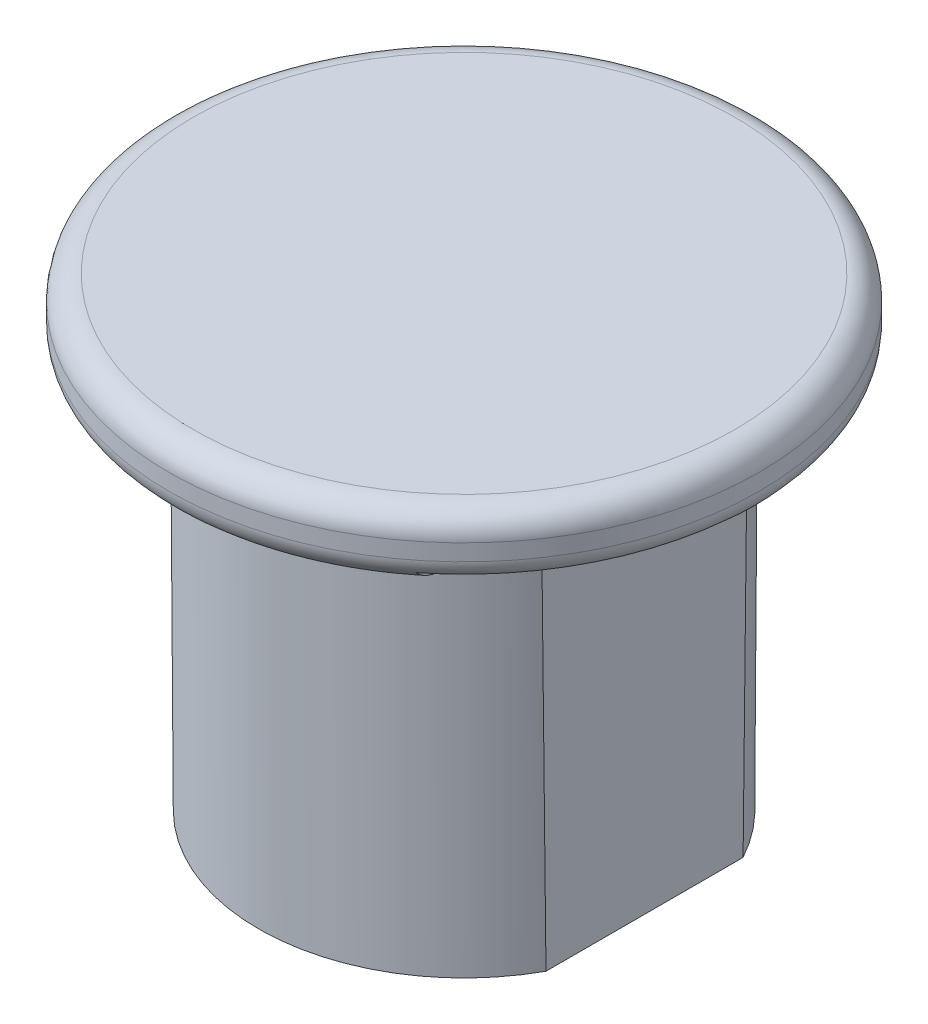
ISO-10303-21;
HEADER;
FILE_DESCRIPTION(('STEP AP214'),'2;1');
FILE_NAME('part.step','',(''),(''),'','','');
FILE_SCHEMA(('AUTOMOTIVE_DESIGN { 1 0 10303 214 1 1 1 1 }'));
ENDSEC;
DATA;
#1=APPLICATION_CONTEXT('core data for automotive mechanical design processes');
#2=APPLICATION_PROTOCOL_DEFINITION('international standard','automotive_design',2000,#1);
#3=PRODUCT_CONTEXT('',#1,'mechanical');
#4=PRODUCT('Part','Part','',(#3));
#5=PRODUCT_RELATED_PRODUCT_CATEGORY('part','',(#4));
#6=PRODUCT_DEFINITION_FORMATION('','',#4);
#7=PRODUCT_DEFINITION_CONTEXT('part definition',#1,'design');
#8=PRODUCT_DEFINITION('design','',#6,#7);
#9=PRODUCT_DEFINITION_SHAPE('','',#8);
#10=(LENGTH_UNIT() NAMED_UNIT(*) SI_UNIT(.MILLI.,.METRE.));
#11=(NAMED_UNIT(*) PLANE_ANGLE_UNIT() SI_UNIT($,.RADIAN.));
#12=(NAMED_UNIT(*) SI_UNIT($,.STERADIAN.) SOLID_ANGLE_UNIT());
#13=UNCERTAINTY_MEASURE_WITH_UNIT(LENGTH_MEASURE(1.E-05),#10,'distance_accuracy_value','');
#14=(GEOMETRIC_REPRESENTATION_CONTEXT(3) GLOBAL_UNCERTAINTY_ASSIGNED_CONTEXT((#13)) GLOBAL_UNIT_ASSIGNED_CONTEXT((#10,
#11,#12)) REPRESENTATION_CONTEXT('',''));
#15=CARTESIAN_POINT('',(0.,0.,0.));
#16=DIRECTION('',(0.,0.,1.));
#17=DIRECTION('',(1.,0.,0.));
#18=AXIS2_PLACEMENT_3D('',#15,#16,#17);
#19=CARTESIAN_POINT('',(0.,0.,0.));
#20=DIRECTION('',(0.,1.,0.));
#21=DIRECTION('',(0.,0.,-1.));
#22=AXIS2_PLACEMENT_3D('',#19,#20,#21);
#23=PLANE('',#22);
#24=CARTESIAN_POINT('',(0.,0.,0.));
#25=DIRECTION('',(0.,1.,0.));
#26=DIRECTION('',(1.,0.,0.));
#27=AXIS2_PLACEMENT_3D('',#24,#25,#26);
#28=CIRCLE('',#27,3.76);
#29=CARTESIAN_POINT('',(3.3,0.,-1.802109874564));
#30=VERTEX_POINT('',#29);
#31=CARTESIAN_POINT('',(3.3,0.,1.802109874564));
#32=VERTEX_POINT('',#31);
#33=EDGE_CURVE('E11',#30,#32,#28,.T.);
#34=ORIENTED_EDGE('',*,*,#33,.F.);
#35=DIRECTION('',(0.,0.,-1.));
#36=VECTOR('',#35,1.);
#37=CARTESIAN_POINT('',(3.3,0.,-2.5));
#38=LINE('',#37,#36);
#39=EDGE_CURVE('E100',#32,#30,#38,.T.);
#40=ORIENTED_EDGE('',*,*,#39,.F.);
#41=EDGE_LOOP('',(#34,#40));
#42=FACE_BOUND('',#41,.T.);
#43=ADVANCED_FACE('F17',(#42),#23,.F.);
#44=CARTESIAN_POINT('',(0.,0.,0.));
#45=DIRECTION('',(0.,1.,0.));
#46=DIRECTION('',(1.,0.,0.));
#47=AXIS2_PLACEMENT_3D('',#44,#45,#46);
#48=CONICAL_SURFACE('',#47,3.76,0.00547939721669572);
#49=CARTESIAN_POINT('',(0.,7.3,0.));
#50=DIRECTION('',(0.,1.,0.));
#51=DIRECTION('',(1.,0.,0.));
#52=AXIS2_PLACEMENT_3D('',#49,#50,#51);
#53=CIRCLE('',#52,3.8);
#54=CARTESIAN_POINT('',(3.3,7.3,-1.884144368142));
#55=VERTEX_POINT('',#54);
#56=CARTESIAN_POINT('',(3.3,7.3,1.884144368142));
#57=VERTEX_POINT('',#56);
#58=EDGE_CURVE('E29',#55,#57,#53,.T.);
#59=ORIENTED_EDGE('',*,*,#58,.F.);
#60=CARTESIAN_POINT('',(3.3,8.030037745854E-11,-1.802109874565));
#61=CARTESIAN_POINT('',(3.3,1.824997814763,-1.822974282172));
#62=CARTESIAN_POINT('',(3.3,3.64999717058,-1.843590626793));
#63=CARTESIAN_POINT('',(3.3,5.474997933768,-1.863976039395));
#64=CARTESIAN_POINT('',(3.3,7.3,-1.884144368142));
#65=B_SPLINE_CURVE_WITH_KNOTS('',4,(#60,#61,#62,#63,#64),.UNSPECIFIED.,.F.,.F.,(5,5),(0.,1.),.UNSPECIFIED.);
#66=EDGE_CURVE('E140',#30,#55,#65,.T.);
#67=ORIENTED_EDGE('',*,*,#66,.F.);
#68=ORIENTED_EDGE('',*,*,#33,.T.);
#69=CARTESIAN_POINT('',(3.3,7.3,1.884144368142));
#70=CARTESIAN_POINT('',(3.3,5.474997933786,1.863976039395));
#71=CARTESIAN_POINT('',(3.3,3.649997170523,1.843590626792));
#72=CARTESIAN_POINT('',(3.3,1.824997814895,1.822974282174));
#73=CARTESIAN_POINT('',(3.3,2.318742420293E-10,1.802109874566));
#74=B_SPLINE_CURVE_WITH_KNOTS('',4,(#69,#70,#71,#72,#73),.UNSPECIFIED.,.F.,.F.,(5,5),(0.,1.),.UNSPECIFIED.);
#75=EDGE_CURVE('E92',#57,#32,#74,.T.);
#76=ORIENTED_EDGE('',*,*,#75,.F.);
#77=EDGE_LOOP('',(#59,#67,#68,#76));
#78=FACE_BOUND('',#77,.T.);
#79=ADVANCED_FACE('F91',(#78),#48,.T.);
#80=CARTESIAN_POINT('',(0.,8.5,0.));
#81=DIRECTION('',(0.,1.,0.));
#82=DIRECTION('',(0.,0.,-1.));
#83=AXIS2_PLACEMENT_3D('',#80,#81,#82);
#84=PLANE('',#83);
#85=CARTESIAN_POINT('',(0.,8.5,0.));
#86=DIRECTION('',(0.,1.,0.));
#87=DIRECTION('',(1.,0.,0.));
#88=AXIS2_PLACEMENT_3D('',#85,#86,#87);
#89=CIRCLE('',#88,4.95);
#90=CARTESIAN_POINT('',(4.95,8.5,0.));
#91=VERTEX_POINT('',#90);
#92=EDGE_CURVE('E127',#91,#91,#89,.T.);
#93=ORIENTED_EDGE('',*,*,#92,.T.);
#94=EDGE_LOOP('',(#93));
#95=FACE_BOUND('',#94,.T.);
#96=ADVANCED_FACE('F228',(#95),#84,.T.);
#97=CARTESIAN_POINT('',(0.,7.3,0.));
#98=DIRECTION('',(0.,1.,0.));
#99=DIRECTION('',(0.,0.,-1.));
#100=AXIS2_PLACEMENT_3D('',#97,#98,#99);
#101=PLANE('',#100);
#102=ORIENTED_EDGE('',*,*,#58,.T.);
#103=DIRECTION('',(0.,0.,-1.));
#104=VECTOR('',#103,1.);
#105=CARTESIAN_POINT('',(3.3,7.3,-2.5));
#106=LINE('',#105,#104);
#107=CARTESIAN_POINT('',(3.3,7.3,3.689512162875));
#108=VERTEX_POINT('',#107);
#109=EDGE_CURVE('E83',#108,#57,#106,.T.);
#110=ORIENTED_EDGE('',*,*,#109,.F.);
#111=CARTESIAN_POINT('',(0.,7.3,0.));
#112=DIRECTION('',(0.,1.,0.));
#113=DIRECTION('',(1.,0.,0.));
#114=AXIS2_PLACEMENT_3D('',#111,#112,#113);
#115=CIRCLE('',#114,4.95);
#116=CARTESIAN_POINT('',(3.3,7.3,-3.689512162875));
#117=VERTEX_POINT('',#116);
#118=EDGE_CURVE('E118',#117,#108,#115,.T.);
#119=ORIENTED_EDGE('',*,*,#118,.F.);
#120=DIRECTION('',(0.,0.,-1.));
#121=VECTOR('',#120,1.);
#122=CARTESIAN_POINT('',(3.3,7.3,-2.5));
#123=LINE('',#122,#121);
#124=EDGE_CURVE('E89',#55,#117,#123,.T.);
#125=ORIENTED_EDGE('',*,*,#124,.F.);
#126=EDGE_LOOP('',(#102,#110,#119,#125));
#127=FACE_BOUND('',#126,.T.);
#128=ADVANCED_FACE('F81',(#127),#101,.F.);
#129=CARTESIAN_POINT('',(3.3,-0.2,-5.));
#130=DIRECTION('',(1.,0.,0.));
#131=DIRECTION('',(0.,1.,0.));
#132=AXIS2_PLACEMENT_3D('',#129,#130,#131);
#133=PLANE('',#132);
#134=DIRECTION('',(0.,0.,1.));
#135=VECTOR('',#134,1.);
#136=CARTESIAN_POINT('',(3.3,7.5,-5.));
#137=LINE('',#136,#135);
#138=CARTESIAN_POINT('',(3.3,7.5,-4.178126471627));
#139=VERTEX_POINT('',#138);
#140=CARTESIAN_POINT('',(3.3,7.5,4.178126471627));
#141=VERTEX_POINT('',#140);
#142=EDGE_CURVE('E102',#139,#141,#137,.T.);
#143=ORIENTED_EDGE('',*,*,#142,.T.);
#144=CARTESIAN_POINT('',(3.3,7.75,4.274342054633));
#145=CARTESIAN_POINT('',(3.3,7.716355003804,4.274342054633));
#146=CARTESIAN_POINT('',(3.3,7.68270779858,4.270528458825));
#147=CARTESIAN_POINT('',(3.3,7.649437517967,4.262900393972));
#148=CARTESIAN_POINT('',(3.3,7.616913692919,4.251541631836));
#149=CARTESIAN_POINT('',(3.3,7.585480458481,4.236609153892));
#150=CARTESIAN_POINT('',(3.3,7.52503709021,4.19981270062));
#151=CARTESIAN_POINT('',(3.3,7.496058000717,4.177865006577));
#152=CARTESIAN_POINT('',(3.3,7.468816945847,4.15270361159));
#153=CARTESIAN_POINT('',(3.3,7.443573658995,4.124607680797));
#154=CARTESIAN_POINT('',(3.3,7.420534828386,4.093890900861));
#155=CARTESIAN_POINT('',(3.3,7.367268740544,4.008868650043));
#156=CARTESIAN_POINT('',(3.3,7.340540563001,3.951165763041));
#157=CARTESIAN_POINT('',(3.3,7.320267119463,3.889048338208));
#158=CARTESIAN_POINT('',(3.3,7.306732704443,3.823866872133));
#159=CARTESIAN_POINT('',(3.3,7.3,3.756925390347));
#160=CARTESIAN_POINT('',(3.3,7.3,3.689512162875));
#161=B_SPLINE_CURVE_WITH_KNOTS('',6,(#144,#145,#146,#147,#148,#149,#150,#151,#152,#153,#154,
#155,#156,#157,#158,#159,#160),.UNSPECIFIED.,.F.,.F.,(7,5,5,7),(0.,0.277244003559,
0.557847201163,1.),.UNSPECIFIED.);
#162=EDGE_CURVE('E101',#141,#108,#161,.T.);
#163=ORIENTED_EDGE('',*,*,#162,.T.);
#164=ORIENTED_EDGE('',*,*,#109,.T.);
#165=ORIENTED_EDGE('',*,*,#75,.T.);
#166=ORIENTED_EDGE('',*,*,#39,.T.);
#167=ORIENTED_EDGE('',*,*,#66,.T.);
#168=ORIENTED_EDGE('',*,*,#124,.T.);
#169=CARTESIAN_POINT('',(3.3,7.75,-4.274342054633));
#170=CARTESIAN_POINT('',(3.3,7.716355003803,-4.274342054633));
#171=CARTESIAN_POINT('',(3.3,7.68270779858,-4.270528458825));
#172=CARTESIAN_POINT('',(3.3,7.649437517967,-4.262900393972));
#173=CARTESIAN_POINT('',(3.3,7.616913692918,-4.251541631836));
#174=CARTESIAN_POINT('',(3.3,7.58548045848,-4.236609153891));
#175=CARTESIAN_POINT('',(3.3,7.525037090209,-4.199812700619));
#176=CARTESIAN_POINT('',(3.3,7.496058000716,-4.177865006577));
#177=CARTESIAN_POINT('',(3.3,7.468816945846,-4.152703611589));
#178=CARTESIAN_POINT('',(3.3,7.443573658994,-4.124607680796));
#179=CARTESIAN_POINT('',(3.3,7.420534828385,-4.09389090086));
#180=CARTESIAN_POINT('',(3.3,7.367268740543,-4.008868650042));
#181=CARTESIAN_POINT('',(3.3,7.340540563001,-3.95116576304));
#182=CARTESIAN_POINT('',(3.3,7.320267119463,-3.889048338207));
#183=CARTESIAN_POINT('',(3.3,7.306732704443,-3.823866872132));
#184=CARTESIAN_POINT('',(3.3,7.3,-3.756925390346));
#185=CARTESIAN_POINT('',(3.3,7.3,-3.689512162875));
#186=B_SPLINE_CURVE_WITH_KNOTS('',6,(#169,#170,#171,#172,#173,#174,#175,#176,#177,#178,#179,
#180,#181,#182,#183,#184,#185),.UNSPECIFIED.,.F.,.F.,(7,5,5,7),(0.,0.27724400356,0.557847201165,
1.),.UNSPECIFIED.);
#187=EDGE_CURVE('E20',#139,#117,#186,.T.);
#188=ORIENTED_EDGE('',*,*,#187,.F.);
#189=EDGE_LOOP('',(#143,#163,#164,#165,#166,#167,#168,#188));
#190=FACE_BOUND('',#189,.T.);
#191=ADVANCED_FACE('F99',(#190),#133,.T.);
#192=CARTESIAN_POINT('',(3.3,7.5,-5.));
#193=DIRECTION('',(0.,1.,0.));
#194=DIRECTION('',(1.,0.,0.));
#195=AXIS2_PLACEMENT_3D('',#192,#193,#194);
#196=PLANE('',#195);
#197=CARTESIAN_POINT('',(0.,7.5,0.));
#198=DIRECTION('',(0.,-1.,0.));
#199=DIRECTION('',(1.,0.,0.));
#200=AXIS2_PLACEMENT_3D('',#197,#198,#199);
#201=CIRCLE('',#200,5.324165738677);
#202=CARTESIAN_POINT('',(5.3,7.5,0.506695976801));
#203=VERTEX_POINT('',#202);
#204=EDGE_CURVE('E124',#203,#141,#201,.T.);
#205=ORIENTED_EDGE('',*,*,#204,.T.);
#206=ORIENTED_EDGE('',*,*,#142,.F.);
#207=CARTESIAN_POINT('',(0.,7.5,0.));
#208=DIRECTION('',(0.,-1.,0.));
#209=DIRECTION('',(1.,0.,0.));
#210=AXIS2_PLACEMENT_3D('',#207,#208,#209);
#211=CIRCLE('',#210,5.324165738677);
#212=CARTESIAN_POINT('',(5.3,7.5,-0.506695976801));
#213=VERTEX_POINT('',#212);
#214=EDGE_CURVE('E117',#139,#213,#211,.T.);
#215=ORIENTED_EDGE('',*,*,#214,.T.);
#216=DIRECTION('',(0.,0.,1.));
#217=VECTOR('',#216,1.);
#218=CARTESIAN_POINT('',(5.3,7.5,-5.));
#219=LINE('',#218,#217);
#220=EDGE_CURVE('E109',#213,#203,#219,.T.);
#221=ORIENTED_EDGE('',*,*,#220,.T.);
#222=EDGE_LOOP('',(#205,#206,#215,#221));
#223=FACE_BOUND('',#222,.T.);
#224=ADVANCED_FACE('F236',(#223),#196,.F.);
#225=CARTESIAN_POINT('',(5.3,-0.2,-5.));
#226=DIRECTION('',(1.,0.,0.));
#227=DIRECTION('',(0.,1.,0.));
#228=AXIS2_PLACEMENT_3D('',#225,#226,#227);
#229=PLANE('',#228);
#230=CARTESIAN_POINT('',(5.3,7.75,-1.034408043279));
#231=CARTESIAN_POINT('',(5.3,7.737100951975,-1.034408043279));
#232=CARTESIAN_POINT('',(5.3,7.724197389763,-1.032202019081));
#233=CARTESIAN_POINT('',(5.3,7.711388968665,-1.027787592253));
#234=CARTESIAN_POINT('',(5.3,7.698763173049,-1.021219958709));
#235=CARTESIAN_POINT('',(5.3,7.686394926562,-1.012595361165));
#236=CARTESIAN_POINT('',(5.3,7.674346626327,-1.002038306961));
#237=CARTESIAN_POINT('',(5.3,7.662668601114,-0.989692531274));
#238=CARTESIAN_POINT('',(5.3,7.644164608334,-0.966741418968));
#239=CARTESIAN_POINT('',(5.3,7.637095229494,-0.957091171362));
#240=CARTESIAN_POINT('',(5.3,7.630200046957,-0.946802890366));
#241=CARTESIAN_POINT('',(5.3,7.623485015174,-0.935914513045));
#242=CARTESIAN_POINT('',(5.3,7.616954107629,-0.924463289156));
#243=CARTESIAN_POINT('',(5.3,7.610609571438,-0.912485084265));
#244=CARTESIAN_POINT('',(5.3,7.604452181938,-0.900013682853));
#245=CARTESIAN_POINT('',(5.3,7.590334166592,-0.869431487914));
#246=CARTESIAN_POINT('',(5.3,7.582535366794,-0.850924260786));
#247=CARTESIAN_POINT('',(5.3,7.575083039545,-0.831636209564));
#248=CARTESIAN_POINT('',(5.3,7.567972725491,-0.811639254942));
#249=CARTESIAN_POINT('',(5.3,7.561198009293,-0.79099895137));
#250=CARTESIAN_POINT('',(5.3,7.554750964662,-0.769773999643));
#251=CARTESIAN_POINT('',(5.3,7.548622599387,-0.748015759487));
#252=CARTESIAN_POINT('',(5.3,7.522166698397,-0.646871134866));
#253=CARTESIAN_POINT('',(5.3,7.505470168735,-0.562020760468));
#254=CARTESIAN_POINT('',(5.3,7.492179665994,-0.472941515529));
#255=CARTESIAN_POINT('',(5.3,7.481966976553,-0.380885775843));
#256=CARTESIAN_POINT('',(5.3,7.474511987254,-0.286904878757));
#257=CARTESIAN_POINT('',(5.3,7.469618614014,-0.191766974579));
#258=CARTESIAN_POINT('',(5.3,7.467157287525,-0.09603855408853));
#259=CARTESIAN_POINT('',(5.3,7.467157287525,0.));
#260=B_SPLINE_CURVE_WITH_KNOTS('',8,(#230,#231,#232,#233,#234,#235,#236,#237,#238,#239,#240,
#241,#242,#243,#244,#245,#246,#247,#248,#249,#250,#251,#252,#253,#254,#255,#256,#257,#258,#259),
.UNSPECIFIED.,.F.,.F.,(9,7,7,7,9),(0.,0.177768135154,0.291910091734,0.447663128132,1.),.UNSPECIFIED.);
#261=CARTESIAN_POINT('',(5.3,7.467157287525,0.));
#262=VERTEX_POINT('',#261);
#263=EDGE_CURVE('E132',#213,#262,#260,.T.);
#264=ORIENTED_EDGE('',*,*,#263,.T.);
#265=CARTESIAN_POINT('',(5.3,7.75,1.034408043279));
#266=CARTESIAN_POINT('',(5.3,7.737100951975,1.034408043279));
#267=CARTESIAN_POINT('',(5.3,7.724197389762,1.032202019081));
#268=CARTESIAN_POINT('',(5.3,7.711388968665,1.027787592253));
#269=CARTESIAN_POINT('',(5.3,7.698763173049,1.021219958709));
#270=CARTESIAN_POINT('',(5.3,7.686394926561,1.012595361164));
#271=CARTESIAN_POINT('',(5.3,7.674346626327,1.00203830696));
#272=CARTESIAN_POINT('',(5.3,7.662668601113,0.989692531274));
#273=CARTESIAN_POINT('',(5.3,7.644164608333,0.966741418967));
#274=CARTESIAN_POINT('',(5.3,7.637095229493,0.957091171361));
#275=CARTESIAN_POINT('',(5.3,7.630200046957,0.946802890365));
#276=CARTESIAN_POINT('',(5.3,7.623485015173,0.935914513044));
#277=CARTESIAN_POINT('',(5.3,7.616954107629,0.924463289155));
#278=CARTESIAN_POINT('',(5.3,7.610609571438,0.912485084264));
#279=CARTESIAN_POINT('',(5.3,7.604452181938,0.900013682851));
#280=CARTESIAN_POINT('',(5.3,7.590334166591,0.869431487913));
#281=CARTESIAN_POINT('',(5.3,7.582535366794,0.850924260784));
#282=CARTESIAN_POINT('',(5.3,7.575083039545,0.831636209562));
#283=CARTESIAN_POINT('',(5.3,7.56797272549,0.81163925494));
#284=CARTESIAN_POINT('',(5.3,7.561198009292,0.790998951368));
#285=CARTESIAN_POINT('',(5.3,7.554750964661,0.769773999642));
#286=CARTESIAN_POINT('',(5.3,7.548622599386,0.748015759485));
#287=CARTESIAN_POINT('',(5.3,7.522166698397,0.646871134864));
#288=CARTESIAN_POINT('',(5.3,7.505470168734,0.562020760466));
#289=CARTESIAN_POINT('',(5.3,7.492179665994,0.472941515528));
#290=CARTESIAN_POINT('',(5.3,7.481966976553,0.380885775841));
#291=CARTESIAN_POINT('',(5.3,7.474511987254,0.286904878757));
#292=CARTESIAN_POINT('',(5.3,7.469618614014,0.191766974578));
#293=CARTESIAN_POINT('',(5.3,7.467157287525,0.09603855408822));
#294=CARTESIAN_POINT('',(5.3,7.467157287525,0.));
#295=B_SPLINE_CURVE_WITH_KNOTS('',8,(#265,#266,#267,#268,#269,#270,#271,#272,#273,#274,#275,
#276,#277,#278,#279,#280,#281,#282,#283,#284,#285,#286,#287,#288,#289,#290,#291,#292,#293,#294),
.UNSPECIFIED.,.F.,.F.,(9,7,7,7,9),(0.,0.177768135156,0.291910091735,0.447663128134,1.),.UNSPECIFIED.);
#296=EDGE_CURVE('E130',#203,#262,#295,.T.);
#297=ORIENTED_EDGE('',*,*,#296,.F.);
#298=ORIENTED_EDGE('',*,*,#220,.F.);
#299=EDGE_LOOP('',(#264,#297,#298));
#300=FACE_BOUND('',#299,.T.);
#301=ADVANCED_FACE('F221',(#300),#229,.F.);
#302=CARTESIAN_POINT('',(0.,8.05,0.));
#303=DIRECTION('',(0.,1.,0.));
#304=DIRECTION('',(1.,0.,0.));
#305=AXIS2_PLACEMENT_3D('',#302,#303,#304);
#306=TOROIDAL_SURFACE('',#305,4.95,0.45);
#307=ORIENTED_EDGE('',*,*,#92,.F.);
#308=EDGE_LOOP('',(#307));
#309=FACE_BOUND('',#308,.T.);
#310=CARTESIAN_POINT('',(0.,8.05,0.));
#311=DIRECTION('',(0.,1.,0.));
#312=DIRECTION('',(1.,0.,0.));
#313=AXIS2_PLACEMENT_3D('',#310,#311,#312);
#314=CIRCLE('',#313,5.4);
#315=CARTESIAN_POINT('',(5.4,8.05,0.));
#316=VERTEX_POINT('',#315);
#317=EDGE_CURVE('E194',#316,#316,#314,.T.);
#318=ORIENTED_EDGE('',*,*,#317,.T.);
#319=EDGE_LOOP('',(#318));
#320=FACE_BOUND('',#319,.T.);
#321=ADVANCED_FACE('F204',(#309,#320),#306,.T.);
#322=CARTESIAN_POINT('',(0.,7.75,0.));
#323=DIRECTION('',(0.,-1.,0.));
#324=DIRECTION('',(1.,0.,0.));
#325=AXIS2_PLACEMENT_3D('',#322,#323,#324);
#326=TOROIDAL_SURFACE('',#325,4.95,0.45);
#327=ORIENTED_EDGE('',*,*,#296,.T.);
#328=ORIENTED_EDGE('',*,*,#263,.F.);
#329=ORIENTED_EDGE('',*,*,#214,.F.);
#330=ORIENTED_EDGE('',*,*,#187,.T.);
#331=ORIENTED_EDGE('',*,*,#118,.T.);
#332=ORIENTED_EDGE('',*,*,#162,.F.);
#333=ORIENTED_EDGE('',*,*,#204,.F.);
#334=EDGE_LOOP('',(#327,#328,#329,#330,#331,#332,#333));
#335=FACE_BOUND('',#334,.T.);
#336=CARTESIAN_POINT('',(0.,7.75,0.));
#337=DIRECTION('',(0.,1.,0.));
#338=DIRECTION('',(1.,0.,0.));
#339=AXIS2_PLACEMENT_3D('',#336,#337,#338);
#340=CIRCLE('',#339,5.4);
#341=CARTESIAN_POINT('',(5.4,7.75,0.));
#342=VERTEX_POINT('',#341);
#343=EDGE_CURVE('E113',#342,#342,#340,.T.);
#344=ORIENTED_EDGE('',*,*,#343,.F.);
#345=EDGE_LOOP('',(#344));
#346=FACE_BOUND('',#345,.T.);
#347=ADVANCED_FACE('F206',(#335,#346),#326,.T.);
#348=CARTESIAN_POINT('',(0.,7.3,0.));
#349=DIRECTION('',(0.,1.,0.));
#350=DIRECTION('',(1.,0.,0.));
#351=AXIS2_PLACEMENT_3D('',#348,#349,#350);
#352=CYLINDRICAL_SURFACE('',#351,5.4);
#353=ORIENTED_EDGE('',*,*,#317,.F.);
#354=EDGE_LOOP('',(#353));
#355=FACE_BOUND('',#354,.T.);
#356=ORIENTED_EDGE('',*,*,#343,.T.);
#357=EDGE_LOOP('',(#356));
#358=FACE_BOUND('',#357,.T.);
#359=ADVANCED_FACE('F209',(#355,#358),#352,.T.);
#360=CLOSED_SHELL('',(#43,#79,#96,#128,#191,#224,#301,#321,#347,#359));
#361=MANIFOLD_SOLID_BREP('B1',#360);
#362=ADVANCED_BREP_SHAPE_REPRESENTATION('',(#18,#361),#14);
#363=SHAPE_DEFINITION_REPRESENTATION(#9,#362);
ENDSEC;
END-ISO-10303-21;
